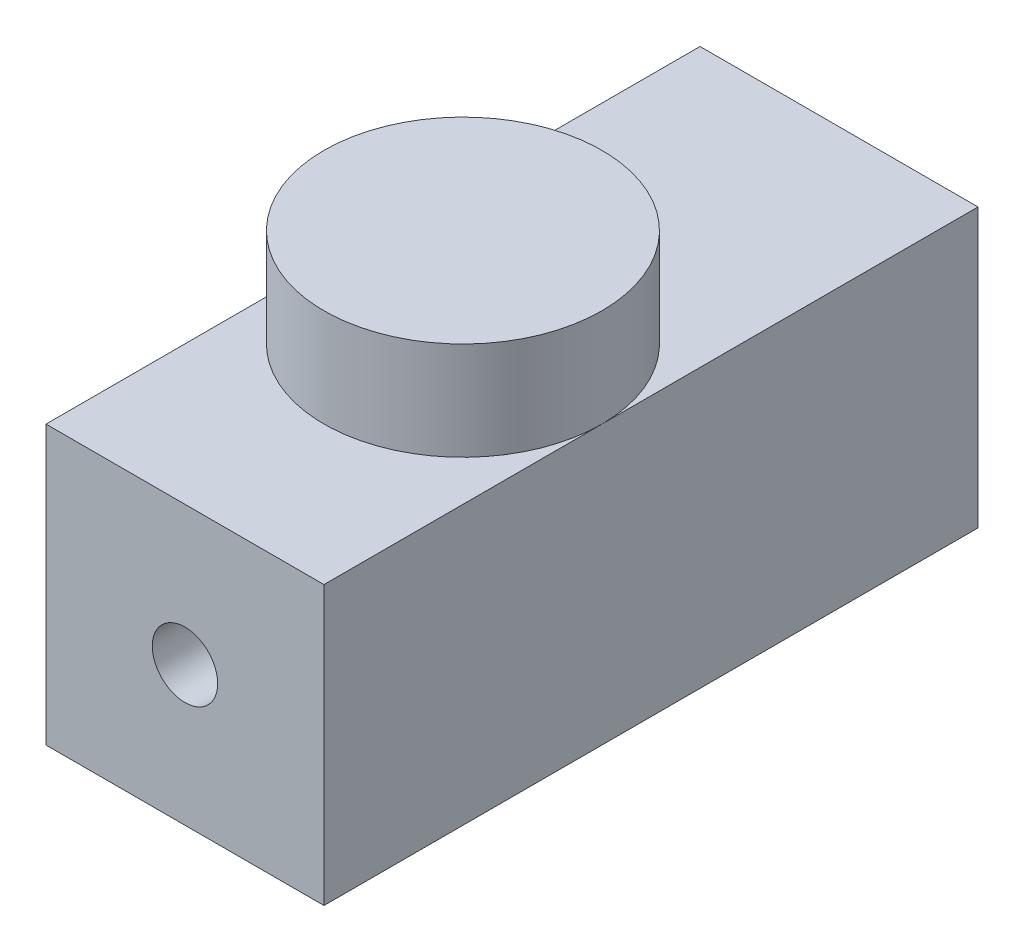
ISO-10303-21;
HEADER;
FILE_DESCRIPTION(('STEP AP214'),'2;1');
FILE_NAME('part.step','',(''),(''),'','','');
FILE_SCHEMA(('AUTOMOTIVE_DESIGN { 1 0 10303 214 1 1 1 1 }'));
ENDSEC;
DATA;
#1=APPLICATION_CONTEXT('core data for automotive mechanical design processes');
#2=APPLICATION_PROTOCOL_DEFINITION('international standard','automotive_design',2000,#1);
#3=PRODUCT_CONTEXT('',#1,'mechanical');
#4=PRODUCT('Part','Part','',(#3));
#5=PRODUCT_RELATED_PRODUCT_CATEGORY('part','',(#4));
#6=PRODUCT_DEFINITION_FORMATION('','',#4);
#7=PRODUCT_DEFINITION_CONTEXT('part definition',#1,'design');
#8=PRODUCT_DEFINITION('design','',#6,#7);
#9=PRODUCT_DEFINITION_SHAPE('','',#8);
#10=(LENGTH_UNIT() NAMED_UNIT(*) SI_UNIT(.MILLI.,.METRE.));
#11=(NAMED_UNIT(*) PLANE_ANGLE_UNIT() SI_UNIT($,.RADIAN.));
#12=(NAMED_UNIT(*) SI_UNIT($,.STERADIAN.) SOLID_ANGLE_UNIT());
#13=UNCERTAINTY_MEASURE_WITH_UNIT(LENGTH_MEASURE(1.E-05),#10,'distance_accuracy_value','');
#14=(GEOMETRIC_REPRESENTATION_CONTEXT(3) GLOBAL_UNCERTAINTY_ASSIGNED_CONTEXT((#13)) GLOBAL_UNIT_ASSIGNED_CONTEXT((#10,
#11,#12)) REPRESENTATION_CONTEXT('',''));
#15=CARTESIAN_POINT('',(0.,0.,0.));
#16=DIRECTION('',(0.,0.,1.));
#17=DIRECTION('',(1.,0.,0.));
#18=AXIS2_PLACEMENT_3D('',#15,#16,#17);
#19=CARTESIAN_POINT('',(0.,0.,2.));
#20=DIRECTION('',(0.,0.,-1.));
#21=DIRECTION('',(-1.,0.,0.));
#22=AXIS2_PLACEMENT_3D('',#19,#20,#21);
#23=CYLINDRICAL_SURFACE('',#22,3.);
#24=CARTESIAN_POINT('',(2.59807621135332,-1.5,-2.55390835220332));
#25=CARTESIAN_POINT('',(2.63732121190706,-1.4320184998094,-2.53834918738087));
#26=CARTESIAN_POINT('',(2.67395099941356,-1.36241468177571,-2.52342292053088));
#27=CARTESIAN_POINT('',(2.74175515732418,-1.22024418755296,-2.4952170083473));
#28=CARTESIAN_POINT('',(2.77292729261281,-1.1476763124049,-2.48193803829003));
#29=CARTESIAN_POINT('',(2.85789750954341,-0.92597484514707,-2.44515231181661));
#30=CARTESIAN_POINT('',(2.90311695811549,-0.772899435534057,-2.42471007878426));
#31=CARTESIAN_POINT('',(2.96883496251602,-0.460056737105672,-2.39461281977425));
#32=CARTESIAN_POINT('',(2.98926236893332,-0.300271543502325,-2.38498884637116));
#33=CARTESIAN_POINT('',(3.00421539914929,0.0205853614363783,-2.37796860747477));
#34=CARTESIAN_POINT('',(2.99877805309421,0.181654904122624,-2.38055486075833));
#35=CARTESIAN_POINT('',(2.96315000144787,0.493223208779222,-2.39717092123124));
#36=CARTESIAN_POINT('',(2.93404929137837,0.643876613125216,-2.41069668213226));
#37=CARTESIAN_POINT('',(2.8536523843714,0.938055541846204,-2.44688349613029));
#38=CARTESIAN_POINT('',(2.80233941255606,1.08157558754765,-2.46955145260105));
#39=CARTESIAN_POINT('',(2.67703177083536,1.36311681866821,-2.52242122973002));
#40=CARTESIAN_POINT('',(2.6022965417271,1.50076190190688,-2.55286194339455));
#41=CARTESIAN_POINT('',(2.43290924776829,1.76216663974117,-2.61761873907662));
#42=CARTESIAN_POINT('',(2.33825182389594,1.88592254442002,-2.6519358626859));
#43=CARTESIAN_POINT('',(2.12196875961792,2.12738220287424,-2.724213742667));
#44=CARTESIAN_POINT('',(1.99870869844901,2.24361042376763,-2.76223070731837));
#45=CARTESIAN_POINT('',(1.73376410903995,2.45411740377086,-2.83495670378048));
#46=CARTESIAN_POINT('',(1.59207580706478,2.54839165608273,-2.86966505552377));
#47=CARTESIAN_POINT('',(1.29165539351073,2.71317640451826,-2.93247086507014));
#48=CARTESIAN_POINT('',(1.1327309990258,2.78337246117049,-2.9604795012328));
#49=CARTESIAN_POINT('',(0.803819139792675,2.89551595249851,-3.0060745623748));
#50=CARTESIAN_POINT('',(0.63383861968251,2.93748093546857,-3.02366746090726));
#51=CARTESIAN_POINT('',(0.300488662815284,2.98933786081781,-3.04551998558555));
#52=CARTESIAN_POINT('',(0.137491631754733,3.00127275329246,-3.05062817359713));
#53=CARTESIAN_POINT('',(-0.188214778226381,2.99851284036458,-3.04945288748782));
#54=CARTESIAN_POINT('',(-0.350924215472211,2.98382425806823,-3.04317207548948));
#55=CARTESIAN_POINT('',(-0.663954012735901,2.92972555253106,-3.02043084852889));
#56=CARTESIAN_POINT('',(-0.814504322154816,2.89143381693145,-3.0044314045083));
#57=CARTESIAN_POINT('',(-1.10692415895838,2.79258875480741,-2.96421102617649));
#58=CARTESIAN_POINT('',(-1.24879227422242,2.73203181811128,-2.93998875863157));
#59=CARTESIAN_POINT('',(-1.52613809020316,2.58772378265098,-2.88443354692245));
#60=CARTESIAN_POINT('',(-1.6611324821036,2.50314108140678,-2.85285472635883));
#61=CARTESIAN_POINT('',(-1.91556256719407,2.31424955495618,-2.78613758631303));
#62=CARTESIAN_POINT('',(-2.03499158666064,2.20993231516289,-2.7509977514327));
#63=CARTESIAN_POINT('',(-2.26404124137376,1.97557238707093,-2.67782380261578));
#64=CARTESIAN_POINT('',(-2.372303881634,1.84420551754709,-2.63976612269924));
#65=CARTESIAN_POINT('',(-2.56553052653588,1.56428261614774,-2.56752921528657));
#66=CARTESIAN_POINT('',(-2.65048808953081,1.41572184788948,-2.53335106163924));
#67=CARTESIAN_POINT('',(-2.79473102937518,1.10411727856912,-2.47297232295241));
#68=CARTESIAN_POINT('',(-2.85388987857851,0.941006719903006,-2.44681123907503));
#69=CARTESIAN_POINT('',(-2.94331018381703,0.605754931675806,-2.40648911663507));
#70=CARTESIAN_POINT('',(-2.97361030155961,0.433626111060827,-2.3923120261295));
#71=CARTESIAN_POINT('',(-3.00254727381295,0.100936270083843,-2.3787648467583));
#72=CARTESIAN_POINT('',(-3.00365486795747,-0.0593655292717487,-2.37823939620428));
#73=CARTESIAN_POINT('',(-2.98039430644696,-0.377847811322213,-2.38914147197056));
#74=CARTESIAN_POINT('',(-2.95600007774496,-0.536025955169475,-2.4005812315199));
#75=CARTESIAN_POINT('',(-2.88559204724414,-0.833626096403907,-2.43260529818103));
#76=CARTESIAN_POINT('',(-2.84137006195668,-0.973558275333163,-2.45242517983944));
#77=CARTESIAN_POINT('',(-2.76061933830015,-1.17655899775583,-2.48718289477135));
#78=CARTESIAN_POINT('',(-2.73132033148845,-1.2430402800381,-2.49959825143357));
#79=CARTESIAN_POINT('',(-2.6681107809456,-1.37347336713796,-2.5258001081459));
#80=CARTESIAN_POINT('',(-2.6342013980018,-1.43742580344605,-2.53958626282639));
#81=CARTESIAN_POINT('',(-2.59807621135331,-1.5,-2.55390835220332));
#82=B_SPLINE_CURVE_WITH_KNOTS('',3,(#24,#25,#26,#27,#28,#29,#30,#31,#32,#33,#34,#35,#36,#37,#38,
#39,#40,#41,#42,#43,#44,#45,#46,#47,#48,#49,#50,#51,#52,#53,#54,#55,#56,#57,#58,#59,#60,#61,#62,
#63,#64,#65,#66,#67,#68,#69,#70,#71,#72,#73,#74,#75,#76,#77,#78,#79,#80,#81),.UNSPECIFIED.,.F.,
.F.,(4,2,2,2,2,2,2,2,2,2,2,2,2,2,2,2,2,2,2,2,2,2,2,2,2,2,2,2,4),(0.,0.23994718859513,
0.47999241596185,0.960278827431643,1.44194035353768,1.92291250037383,2.38290639013268,
2.84324827868749,3.31993293521606,3.79674598301762,4.31525372702653,4.83386781872064,
5.35901742337412,5.88384029529329,6.37185612374836,6.85975789561614,7.32615067846419,
7.79261911753865,8.27776478022382,8.76311777175903,9.28400023674185,9.80502653165455,
10.3285801802524,10.8514314394011,11.3298742473193,11.8088066936934,12.2511922960062,
12.4721326598609,12.6930174986392),.UNSPECIFIED.);
#83=CARTESIAN_POINT('',(2.59807621135331,-1.5,-2.55390835220332));
#84=VERTEX_POINT('',#83);
#85=CARTESIAN_POINT('',(-2.59807621135331,-1.5,-2.55390835220332));
#86=VERTEX_POINT('',#85);
#87=EDGE_CURVE('E287',#84,#86,#82,.T.);
#88=ORIENTED_EDGE('',*,*,#87,.T.);
#89=DIRECTION('',(0.,0.,-1.));
#90=VECTOR('',#89,1.);
#91=CARTESIAN_POINT('',(-2.59807621135331,-1.5,2.));
#92=LINE('',#91,#90);
#93=CARTESIAN_POINT('',(-2.59807621135331,-1.5,0.));
#94=VERTEX_POINT('',#93);
#95=EDGE_CURVE('E195',#86,#94,#92,.F.);
#96=ORIENTED_EDGE('',*,*,#95,.T.);
#97=CARTESIAN_POINT('',(0.,0.,0.));
#98=DIRECTION('',(0.,0.,-1.));
#99=DIRECTION('',(-1.,0.,0.));
#100=AXIS2_PLACEMENT_3D('',#97,#98,#99);
#101=CIRCLE('',#100,3.);
#102=CARTESIAN_POINT('',(2.59807621135332,-1.5,0.));
#103=VERTEX_POINT('',#102);
#104=EDGE_CURVE('E218',#103,#94,#101,.T.);
#105=ORIENTED_EDGE('',*,*,#104,.F.);
#106=DIRECTION('',(0.,0.,-1.));
#107=VECTOR('',#106,1.);
#108=CARTESIAN_POINT('',(2.59807621135332,-1.5,2.));
#109=LINE('',#108,#107);
#110=EDGE_CURVE('E204',#103,#84,#109,.T.);
#111=ORIENTED_EDGE('',*,*,#110,.T.);
#112=EDGE_LOOP('',(#88,#96,#105,#111));
#113=FACE_BOUND('',#112,.T.);
#114=CARTESIAN_POINT('',(0.,0.,-12.));
#115=DIRECTION('',(0.,0.,-1.));
#116=DIRECTION('',(-1.,0.,0.));
#117=AXIS2_PLACEMENT_3D('',#114,#115,#116);
#118=CIRCLE('',#117,3.);
#119=CARTESIAN_POINT('',(-3.,0.,-12.));
#120=VERTEX_POINT('',#119);
#121=EDGE_CURVE('E11',#120,#120,#118,.F.);
#122=ORIENTED_EDGE('',*,*,#121,.F.);
#123=EDGE_LOOP('',(#122));
#124=FACE_BOUND('',#123,.T.);
#125=ADVANCED_FACE('F42',(#113,#124),#23,.F.);
#126=CARTESIAN_POINT('',(0.,0.,21.));
#127=DIRECTION('',(0.,0.,-1.));
#128=DIRECTION('',(-1.,0.,0.));
#129=AXIS2_PLACEMENT_3D('',#126,#127,#128);
#130=CYLINDRICAL_SURFACE('',#129,3.5);
#131=CARTESIAN_POINT('',(2.51489137764372,2.43419829895866,2.36435903736387));
#132=CARTESIAN_POINT('',(2.55104727161985,2.3968592590722,2.41997618318839));
#133=CARTESIAN_POINT('',(2.58543176127952,2.35965468387822,2.4768556993659));
#134=CARTESIAN_POINT('',(2.65063489261218,2.28616127627483,2.59336511233787));
#135=CARTESIAN_POINT('',(2.68144694491816,2.24987422966124,2.65299981651324));
#136=CARTESIAN_POINT('',(2.73990732764464,2.17832164532824,2.77621833042016));
#137=CARTESIAN_POINT('',(2.76748337136312,2.14308920007419,2.83985604960378));
#138=CARTESIAN_POINT('',(2.81855932452775,2.07545640218766,2.97013778580621));
#139=CARTESIAN_POINT('',(2.84206227648358,2.04305394466989,3.03677951159776));
#140=CARTESIAN_POINT('',(2.89255149917531,1.97121832568649,3.19831429873823));
#141=CARTESIAN_POINT('',(2.9176642071026,1.93355254699554,3.29462014616058));
#142=CARTESIAN_POINT('',(2.9584848327623,1.87050740704512,3.49258412606976));
#143=CARTESIAN_POINT('',(2.97425323357771,1.84504923884585,3.59420309912707));
#144=CARTESIAN_POINT('',(2.99364153625954,1.81339810629114,3.78572968252594));
#145=CARTESIAN_POINT('',(2.99873721997319,1.80487516697823,3.87508639592764));
#146=CARTESIAN_POINT('',(3.00084618039508,1.80136928186678,4.05420987010352));
#147=CARTESIAN_POINT('',(2.99785714814791,1.80639020412786,4.1439767407077));
#148=CARTESIAN_POINT('',(2.98412011563994,1.82898435745681,4.32072531783922));
#149=CARTESIAN_POINT('',(2.97341308903591,1.84649129698581,4.40771920930295));
#150=CARTESIAN_POINT('',(2.94506722408364,1.89136781681036,4.57797387127647));
#151=CARTESIAN_POINT('',(2.92741786911567,1.91875235498569,4.66122876355261));
#152=CARTESIAN_POINT('',(2.88781972012299,1.97778753830069,4.81629104045118));
#153=CARTESIAN_POINT('',(2.86638523236495,2.00885158464487,4.88846139119754));
#154=CARTESIAN_POINT('',(2.81885732552745,2.07502121949334,5.02935430790497));
#155=CARTESIAN_POINT('',(2.79276031530613,2.11012991578893,5.09807416360722));
#156=CARTESIAN_POINT('',(2.70776333039438,2.21957251614343,5.29976954044158));
#157=CARTESIAN_POINT('',(2.64226497106846,2.29785120632489,5.42787579417068));
#158=CARTESIAN_POINT('',(2.51961635591613,2.43038828283934,5.63109608248835));
#159=CARTESIAN_POINT('',(2.46703909451512,2.48389339413969,5.7095681571944));
#160=CARTESIAN_POINT('',(2.3546437027452,2.59068787023778,5.86133859206422));
#161=CARTESIAN_POINT('',(2.29482300362978,2.64397715153117,5.93463510213875));
#162=CARTESIAN_POINT('',(2.10467877779133,2.8012988480337,6.14621115372963));
#163=CARTESIAN_POINT('',(1.96336869956244,2.90313159946516,6.27668382174231));
#164=CARTESIAN_POINT('',(1.69293861392622,3.06626259460991,6.48084458173163));
#165=CARTESIAN_POINT('',(1.57041686660689,3.1311714428974,6.56043661638214));
#166=CARTESIAN_POINT('',(1.310436519264,3.24853732941626,6.70270730764478));
#167=CARTESIAN_POINT('',(1.1729983986845,3.3010111327803,6.76540875221549));
#168=CARTESIAN_POINT('',(0.907285771269549,3.38277006701788,6.8624640877246));
#169=CARTESIAN_POINT('',(0.780771114579154,3.41436245571142,6.8996716544676));
#170=CARTESIAN_POINT('',(0.521318341934607,3.46346882240351,6.95733808483595));
#171=CARTESIAN_POINT('',(0.388383728169682,3.48099038631572,6.97780597332664));
#172=CARTESIAN_POINT('',(0.119388231108074,3.50056873534359,7.00066939854563));
#173=CARTESIAN_POINT('',(-0.0166811387744239,3.50257691886003,7.00300813886013));
#174=CARTESIAN_POINT('',(-0.287189024306195,3.49082446568215,6.98929216444791));
#175=CARTESIAN_POINT('',(-0.421627443840481,3.47706290416516,6.97323637096681));
#176=CARTESIAN_POINT('',(-0.678503122345018,3.43595027794409,6.92504743473385));
#177=CARTESIAN_POINT('',(-0.801206644279197,3.40928397851332,6.89372389826069));
#178=CARTESIAN_POINT('',(-1.03895858306511,3.34451435739044,6.81712472164344));
#179=CARTESIAN_POINT('',(-1.15400333970316,3.30640561448337,6.77184246784944));
#180=CARTESIAN_POINT('',(-1.41502594680357,3.20527096280849,6.6505229045574));
#181=CARTESIAN_POINT('',(-1.55703275657344,3.13822380620818,6.56928996043567));
#182=CARTESIAN_POINT('',(-1.82208855058899,2.99215460455576,6.38868740049971));
#183=CARTESIAN_POINT('',(-1.9451053105068,2.91311264641347,6.28928756789711));
#184=CARTESIAN_POINT('',(-2.17372268780184,2.74685740405588,6.0736544527252));
#185=CARTESIAN_POINT('',(-2.27899704233387,2.65952941901191,5.95716707982304));
#186=CARTESIAN_POINT('',(-2.46982445935934,2.48329999146304,5.71007907293699));
#187=CARTESIAN_POINT('',(-2.55537755514185,2.39439855161437,5.5794784627765));
#188=CARTESIAN_POINT('',(-2.6909490306155,2.23988696926097,5.33206703564061));
#189=CARTESIAN_POINT('',(-2.74465667667409,2.1732387272304,5.21791941315249));
#190=CARTESIAN_POINT('',(-2.83851721615466,2.04910297280901,4.97939016279977));
#191=CARTESIAN_POINT('',(-2.87869145022314,1.99160111392147,4.85502503570241));
#192=CARTESIAN_POINT('',(-2.93329316695613,1.90982575819557,4.63581072366294));
#193=CARTESIAN_POINT('',(-2.95184234882337,1.88078039322871,4.54382047239381));
#194=CARTESIAN_POINT('',(-2.9803621627429,1.83525910488157,4.35559592962962));
#195=CARTESIAN_POINT('',(-2.99035710206832,1.81874758123284,4.25937448594567));
#196=CARTESIAN_POINT('',(-3.00091812980939,1.80128301695993,4.06407766213972));
#197=CARTESIAN_POINT('',(-3.00140233077628,1.80046509966333,3.96498484720031));
#198=CARTESIAN_POINT('',(-2.99267001381543,1.81493206716691,3.76837527672561));
#199=CARTESIAN_POINT('',(-2.98343987708806,1.83023955865307,3.67086092893567));
#200=CARTESIAN_POINT('',(-2.95288676851072,1.87921476953453,3.45702241630219));
#201=CARTESIAN_POINT('',(-2.929167099891,1.91644468020788,3.34189751756191));
#202=CARTESIAN_POINT('',(-2.87017835611937,2.00370737513847,3.11940392455444));
#203=CARTESIAN_POINT('',(-2.8348492117846,2.05380644561664,3.01207919376662));
#204=CARTESIAN_POINT('',(-2.75623362324816,2.15805830117741,2.81080534574606));
#205=CARTESIAN_POINT('',(-2.71348845447864,2.21183920264226,2.71644566587264));
#206=CARTESIAN_POINT('',(-2.64327511874505,2.29442527880475,2.58026176837923));
#207=CARTESIAN_POINT('',(-2.61903205699824,2.32208678102268,2.53603092139465));
#208=CARTESIAN_POINT('',(-2.56849585284578,2.3778657925977,2.44908032569322));
#209=CARTESIAN_POINT('',(-2.54220346821209,2.4059831303845,2.4063600268398));
#210=CARTESIAN_POINT('',(-2.51489137764373,2.43419829895866,2.36435903736387));
#211=B_SPLINE_CURVE_WITH_KNOTS('',3,(#131,#132,#133,#134,#135,#136,#137,#138,#139,#140,#141,
#142,#143,#144,#145,#146,#147,#148,#149,#150,#151,#152,#153,#154,#155,#156,#157,#158,#159,#160,
#161,#162,#163,#164,#165,#166,#167,#168,#169,#170,#171,#172,#173,#174,#175,#176,#177,#178,#179,
#180,#181,#182,#183,#184,#185,#186,#187,#188,#189,#190,#191,#192,#193,#194,#195,#196,#197,#198,
#199,#200,#201,#202,#203,#204,#205,#206,#207,#208,#209,#210),.UNSPECIFIED.,.F.,.F.,(4,2,2,2,2,2,
2,2,2,2,2,2,2,2,2,2,2,2,2,2,2,2,2,2,2,2,2,2,2,2,2,2,2,2,2,2,2,2,2,4),(0.,0.228359937932881,
0.457134601765042,0.690311456162153,0.923313374720464,1.24159562653338,1.55779456373088,
1.8262091891625,2.09470048059399,2.36177679254866,2.62925925418337,2.87322930566078,
3.11738808288767,3.60705011577487,3.93241305020062,4.25789170816498,4.90681717899346,
5.38476259322378,5.86205992015054,6.26714048266651,6.67200250980327,7.07813240976237,
7.48428612858193,7.87092370043454,8.25774474373482,8.78527864552214,9.31369810886647,
9.85096929913652,10.3882395824971,10.8153476834947,11.2417790961168,11.5355041678648,
11.8283918086644,12.1238001167752,12.4196231183456,12.7874543767605,13.1572196323842,
13.5067492476582,13.6792799750752,13.8517472062458),.UNSPECIFIED.);
#212=CARTESIAN_POINT('',(2.51489137764372,2.43419829895866,2.36435903736387));
#213=VERTEX_POINT('',#212);
#214=CARTESIAN_POINT('',(-2.51489137764372,2.43419829895867,2.36435903736386));
#215=VERTEX_POINT('',#214);
#216=EDGE_CURVE('E188',#213,#215,#211,.T.);
#217=ORIENTED_EDGE('',*,*,#216,.F.);
#218=CARTESIAN_POINT('',(0.,0.,2.36435903736386));
#219=DIRECTION('',(0.,0.,1.));
#220=DIRECTION('',(1.,0.,0.));
#221=AXIS2_PLACEMENT_3D('',#218,#219,#220);
#222=CIRCLE('',#221,3.5);
#223=EDGE_CURVE('E448',#215,#213,#222,.T.);
#224=ORIENTED_EDGE('',*,*,#223,.F.);
#225=EDGE_LOOP('',(#217,#224));
#226=FACE_BOUND('',#225,.T.);
#227=CARTESIAN_POINT('',(0.,0.,16.));
#228=DIRECTION('',(0.,0.,1.));
#229=DIRECTION('',(1.,0.,0.));
#230=AXIS2_PLACEMENT_3D('',#227,#228,#229);
#231=CIRCLE('',#230,3.5);
#232=CARTESIAN_POINT('',(3.5,0.,16.));
#233=VERTEX_POINT('',#232);
#234=EDGE_CURVE('E350',#233,#233,#231,.T.);
#235=ORIENTED_EDGE('',*,*,#234,.T.);
#236=EDGE_LOOP('',(#235));
#237=FACE_BOUND('',#236,.T.);
#238=ADVANCED_FACE('F246',(#226,#237),#130,.F.);
#239=CARTESIAN_POINT('',(8.5,8.5,21.));
#240=DIRECTION('',(0.,-1.,0.));
#241=DIRECTION('',(1.,0.,0.));
#242=AXIS2_PLACEMENT_3D('',#239,#240,#241);
#243=PLANE('',#242);
#244=CARTESIAN_POINT('',(0.,8.5,4.));
#245=DIRECTION('',(0.,1.,0.));
#246=DIRECTION('',(-1.,0.,0.));
#247=AXIS2_PLACEMENT_3D('',#244,#245,#246);
#248=CIRCLE('',#247,3.);
#249=CARTESIAN_POINT('',(-3.,8.5,4.));
#250=VERTEX_POINT('',#249);
#251=EDGE_CURVE('E319',#250,#250,#248,.T.);
#252=ORIENTED_EDGE('',*,*,#251,.F.);
#253=EDGE_LOOP('',(#252));
#254=FACE_BOUND('',#253,.T.);
#255=DIRECTION('',(1.,0.,0.));
#256=VECTOR('',#255,1.);
#257=CARTESIAN_POINT('',(-7.0500861476354,8.49999999999999,4.));
#258=LINE('',#257,#256);
#259=CARTESIAN_POINT('',(-7.0500861476354,8.49999999999999,4.));
#260=VERTEX_POINT('',#259);
#261=CARTESIAN_POINT('',(-4.74236756091018,8.49999999999999,4.));
#262=VERTEX_POINT('',#261);
#263=EDGE_CURVE('E156',#260,#262,#258,.T.);
#264=ORIENTED_EDGE('',*,*,#263,.F.);
#265=CARTESIAN_POINT('',(0.,8.5,4.));
#266=DIRECTION('',(0.,1.,0.));
#267=DIRECTION('',(-1.,0.,0.));
#268=AXIS2_PLACEMENT_3D('',#265,#266,#267);
#269=CIRCLE('',#268,7.0500861476354);
#270=CARTESIAN_POINT('',(7.05008614763539,8.5,4.));
#271=VERTEX_POINT('',#270);
#272=EDGE_CURVE('E149',#260,#271,#269,.T.);
#273=ORIENTED_EDGE('',*,*,#272,.T.);
#274=DIRECTION('',(1.,0.,0.));
#275=VECTOR('',#274,1.);
#276=CARTESIAN_POINT('',(4.74236756091018,8.5,4.));
#277=LINE('',#276,#275);
#278=CARTESIAN_POINT('',(4.74236756091018,8.5,4.));
#279=VERTEX_POINT('',#278);
#280=EDGE_CURVE('E154',#279,#271,#277,.T.);
#281=ORIENTED_EDGE('',*,*,#280,.F.);
#282=CARTESIAN_POINT('',(0.,8.5,4.));
#283=DIRECTION('',(0.,-1.,0.));
#284=DIRECTION('',(1.,0.,0.));
#285=AXIS2_PLACEMENT_3D('',#282,#283,#284);
#286=CIRCLE('',#285,4.74236756091018);
#287=EDGE_CURVE('E181',#262,#279,#286,.T.);
#288=ORIENTED_EDGE('',*,*,#287,.F.);
#289=EDGE_LOOP('',(#264,#273,#281,#288));
#290=FACE_BOUND('',#289,.T.);
#291=ADVANCED_FACE('F151',(#254,#290),#243,.F.);
#292=CARTESIAN_POINT('',(0.,8.5,4.));
#293=DIRECTION('',(0.,1.,0.));
#294=DIRECTION('',(-1.,0.,0.));
#295=AXIS2_PLACEMENT_3D('',#292,#293,#294);
#296=CIRCLE('',#295,8.5);
#297=CARTESIAN_POINT('',(-8.5,8.49999999999999,4.));
#298=VERTEX_POINT('',#297);
#299=CARTESIAN_POINT('',(8.49999999999999,8.5,4.));
#300=VERTEX_POINT('',#299);
#301=EDGE_CURVE('E161',#298,#300,#296,.T.);
#302=ORIENTED_EDGE('',*,*,#301,.F.);
#303=DIRECTION('',(0.,0.,-1.));
#304=VECTOR('',#303,1.);
#305=CARTESIAN_POINT('',(-8.5,8.49999999999999,21.));
#306=LINE('',#305,#304);
#307=CARTESIAN_POINT('',(-8.5,8.49999999999999,21.));
#308=VERTEX_POINT('',#307);
#309=EDGE_CURVE('E438',#308,#298,#306,.T.);
#310=ORIENTED_EDGE('',*,*,#309,.F.);
#311=DIRECTION('',(-1.,0.,0.));
#312=VECTOR('',#311,1.);
#313=CARTESIAN_POINT('',(8.5,8.5,21.));
#314=LINE('',#313,#312);
#315=CARTESIAN_POINT('',(8.5,8.5,21.));
#316=VERTEX_POINT('',#315);
#317=EDGE_CURVE('E434',#316,#308,#314,.T.);
#318=ORIENTED_EDGE('',*,*,#317,.F.);
#319=DIRECTION('',(0.,0.,-1.));
#320=VECTOR('',#319,1.);
#321=CARTESIAN_POINT('',(8.5,8.5,21.));
#322=LINE('',#321,#320);
#323=EDGE_CURVE('E441',#316,#300,#322,.T.);
#324=ORIENTED_EDGE('',*,*,#323,.T.);
#325=EDGE_LOOP('',(#302,#310,#318,#324));
#326=FACE_BOUND('',#325,.T.);
#327=ADVANCED_FACE('F258',(#326),#243,.F.);
#328=CARTESIAN_POINT('',(-2.5475576701565,1.58428214571357,0.));
#329=VERTEX_POINT('',#328);
#330=CARTESIAN_POINT('',(2.5475576701565,1.58428214571357,0.));
#331=VERTEX_POINT('',#330);
#332=EDGE_CURVE('E219',#329,#331,#101,.T.);
#333=ORIENTED_EDGE('',*,*,#332,.F.);
#334=CARTESIAN_POINT('',(-2.5475576701565,1.58428214571357,0.));
#335=CARTESIAN_POINT('',(-2.50126774732187,1.65870011455872,-0.0294888935608918));
#336=CARTESIAN_POINT('',(-2.45188663510014,1.7308504974432,-0.0598031355130589));
#337=CARTESIAN_POINT('',(-2.3471954619681,1.87037304891713,-0.121212166214668));
#338=CARTESIAN_POINT('',(-2.29188483514368,1.93774476040775,-0.15230702924947));
#339=CARTESIAN_POINT('',(-2.17522256381325,2.06787026701592,-0.214601124978778));
#340=CARTESIAN_POINT('',(-2.11383430957125,2.13059152910605,-0.245799740225049));
#341=CARTESIAN_POINT('',(-1.98555141446926,2.25062253618106,-0.307283739912744));
#342=CARTESIAN_POINT('',(-1.91865684579781,2.3079323520896,-0.337569136319483));
#343=CARTESIAN_POINT('',(-1.77946575530546,2.41688396784409,-0.396507207707698));
#344=CARTESIAN_POINT('',(-1.70715811598851,2.4685135331752,-0.425156296899396));
#345=CARTESIAN_POINT('',(-1.55758525984018,2.56551573676955,-0.47999114835835));
#346=CARTESIAN_POINT('',(-1.48032077721012,2.61088929854316,-0.506177274026153));
#347=CARTESIAN_POINT('',(-1.32140382124292,2.69480003623867,-0.555309339238523));
#348=CARTESIAN_POINT('',(-1.23976123533201,2.73335183578564,-0.578262187775081));
#349=CARTESIAN_POINT('',(-1.07252742674706,2.80319231667098,-0.620298649865501));
#350=CARTESIAN_POINT('',(-0.986939165062856,2.83448634149651,-0.639385108703793));
#351=CARTESIAN_POINT('',(-0.820456225093919,2.88682399323958,-0.671554060708586));
#352=CARTESIAN_POINT('',(-0.739849419339515,2.90854384700735,-0.685026296005944));
#353=CARTESIAN_POINT('',(-0.576592919249843,2.94525659133011,-0.707906148295792));
#354=CARTESIAN_POINT('',(-0.493944383501248,2.96025320851671,-0.717316016915435));
#355=CARTESIAN_POINT('',(-0.32731092271939,2.98327602315158,-0.731797172960318));
#356=CARTESIAN_POINT('',(-0.243326219992719,2.99130336802371,-0.736869174571727));
#357=CARTESIAN_POINT('',(-0.0748581991796156,3.00025391473162,-0.742527378090932));
#358=CARTESIAN_POINT('',(0.00962505989700037,3.00117794109292,-0.743114100632394));
#359=CARTESIAN_POINT('',(0.239762802000241,2.9939472606468,-0.738536616352031));
#360=CARTESIAN_POINT('',(0.385187914249129,2.97869566744741,-0.728876142076195));
#361=CARTESIAN_POINT('',(0.670798220293792,2.92764780986287,-0.696891391659853));
#362=CARTESIAN_POINT('',(0.810984087189237,2.89185419429652,-0.674568748264135));
#363=CARTESIAN_POINT('',(1.08327124489216,2.80128175832323,-0.6190848549864));
#364=CARTESIAN_POINT('',(1.21534487913748,2.74644182053373,-0.585888733150598));
#365=CARTESIAN_POINT('',(1.46858699620422,2.61979612942411,-0.511182777667418));
#366=CARTESIAN_POINT('',(1.58974642972158,2.54797647328241,-0.469666135527385));
#367=CARTESIAN_POINT('',(1.83421871607757,2.37917131612338,-0.375496989183479));
#368=CARTESIAN_POINT('',(1.9558272978212,2.28014249724744,-0.322099395576848));
#369=CARTESIAN_POINT('',(2.18152748778806,2.06523382927629,-0.212682134133763));
#370=CARTESIAN_POINT('',(2.28563690070969,1.9493713343727,-0.156665206475505));
#371=CARTESIAN_POINT('',(2.41008269397287,1.78714771517011,-0.0844516960475288));
#372=CARTESIAN_POINT('',(2.43893728773514,1.74756734022151,-0.0672724897298099));
#373=CARTESIAN_POINT('',(2.49470037323961,1.66699257931917,-0.0333089569944928));
#374=CARTESIAN_POINT('',(2.52161168324382,1.62600037381415,-0.0165240835558002));
#375=CARTESIAN_POINT('',(2.5475576701565,1.58428214571357,0.));
#376=B_SPLINE_CURVE_WITH_KNOTS('',3,(#334,#335,#336,#337,#338,#339,#340,#341,#342,#343,#344,
#345,#346,#347,#348,#349,#350,#351,#352,#353,#354,#355,#356,#357,#358,#359,#360,#361,#362,#363,
#364,#365,#366,#367,#368,#369,#370,#371,#372,#373,#374,#375),.UNSPECIFIED.,.F.,.F.,(4,2,2,2,2,2,
2,2,2,2,2,2,2,2,2,2,2,2,2,2,4),(0.,0.277302390519644,0.55463127043791,0.833746122992579,
1.11285731689529,1.39255837295331,1.67221809527246,1.95127085796432,2.23011751309055,
2.48343015884598,2.73660222147633,2.98973259384485,3.2428335833828,3.68013987647702,
4.11738979318698,4.5560559581628,4.99508255013035,5.49022588813401,5.98486234750839,
6.14054200343149,6.29599115020664),.UNSPECIFIED.);
#377=EDGE_CURVE('E208',#329,#331,#376,.T.);
#378=ORIENTED_EDGE('',*,*,#377,.T.);
#379=EDGE_LOOP('',(#333,#378));
#380=FACE_BOUND('',#379,.T.);
#381=ADVANCED_FACE('F248',(#380),#23,.F.);
#382=CARTESIAN_POINT('',(0.,0.,21.));
#383=DIRECTION('',(0.,0.,1.));
#384=DIRECTION('',(1.,0.,0.));
#385=AXIS2_PLACEMENT_3D('',#382,#383,#384);
#386=PLANE('',#385);
#387=DIRECTION('',(0.,-1.,0.));
#388=VECTOR('',#387,1.);
#389=CARTESIAN_POINT('',(-8.5,-8.50000000000001,21.));
#390=LINE('',#389,#388);
#391=CARTESIAN_POINT('',(-8.5,-8.50000000000001,21.));
#392=VERTEX_POINT('',#391);
#393=EDGE_CURVE('E418',#308,#392,#390,.T.);
#394=ORIENTED_EDGE('',*,*,#393,.T.);
#395=DIRECTION('',(1.,0.,0.));
#396=VECTOR('',#395,1.);
#397=CARTESIAN_POINT('',(8.5,-8.5,21.));
#398=LINE('',#397,#396);
#399=CARTESIAN_POINT('',(8.5,-8.5,21.));
#400=VERTEX_POINT('',#399);
#401=EDGE_CURVE('E424',#392,#400,#398,.T.);
#402=ORIENTED_EDGE('',*,*,#401,.T.);
#403=DIRECTION('',(0.,1.,0.));
#404=VECTOR('',#403,1.);
#405=CARTESIAN_POINT('',(8.5,-8.5,21.));
#406=LINE('',#405,#404);
#407=EDGE_CURVE('E431',#400,#316,#406,.T.);
#408=ORIENTED_EDGE('',*,*,#407,.T.);
#409=ORIENTED_EDGE('',*,*,#317,.T.);
#410=EDGE_LOOP('',(#394,#402,#408,#409));
#411=FACE_BOUND('',#410,.T.);
#412=CARTESIAN_POINT('',(0.,0.,21.));
#413=DIRECTION('',(0.,0.,1.));
#414=DIRECTION('',(1.,0.,0.));
#415=AXIS2_PLACEMENT_3D('',#412,#413,#414);
#416=CIRCLE('',#415,2.);
#417=CARTESIAN_POINT('',(2.,0.,21.));
#418=VERTEX_POINT('',#417);
#419=EDGE_CURVE('E360',#418,#418,#416,.T.);
#420=ORIENTED_EDGE('',*,*,#419,.F.);
#421=EDGE_LOOP('',(#420));
#422=FACE_BOUND('',#421,.T.);
#423=ADVANCED_FACE('F257',(#411,#422),#386,.T.);
#424=CARTESIAN_POINT('',(-8.5,-8.50000000000001,21.));
#425=DIRECTION('',(1.,0.,0.));
#426=DIRECTION('',(0.,0.,-1.));
#427=AXIS2_PLACEMENT_3D('',#424,#425,#426);
#428=PLANE('',#427);
#429=ORIENTED_EDGE('',*,*,#309,.T.);
#430=CARTESIAN_POINT('',(-8.5,8.5,-19.));
#431=VERTEX_POINT('',#430);
#432=EDGE_CURVE('E437',#298,#431,#306,.T.);
#433=ORIENTED_EDGE('',*,*,#432,.T.);
#434=DIRECTION('',(0.,1.,0.));
#435=VECTOR('',#434,1.);
#436=CARTESIAN_POINT('',(-8.5,-8.5,-19.));
#437=LINE('',#436,#435);
#438=CARTESIAN_POINT('',(-8.5,-8.5,-19.));
#439=VERTEX_POINT('',#438);
#440=EDGE_CURVE('E416',#439,#431,#437,.T.);
#441=ORIENTED_EDGE('',*,*,#440,.F.);
#442=DIRECTION('',(0.,0.,-1.));
#443=VECTOR('',#442,1.);
#444=CARTESIAN_POINT('',(-8.5,-8.50000000000001,21.));
#445=LINE('',#444,#443);
#446=EDGE_CURVE('E445',#392,#439,#445,.T.);
#447=ORIENTED_EDGE('',*,*,#446,.F.);
#448=ORIENTED_EDGE('',*,*,#393,.F.);
#449=EDGE_LOOP('',(#429,#433,#441,#447,#448));
#450=FACE_BOUND('',#449,.T.);
#451=ADVANCED_FACE('F44',(#450),#428,.F.);
#452=CARTESIAN_POINT('',(8.5,-8.5,21.));
#453=DIRECTION('',(0.,1.,0.));
#454=DIRECTION('',(-1.,0.,0.));
#455=AXIS2_PLACEMENT_3D('',#452,#453,#454);
#456=PLANE('',#455);
#457=ORIENTED_EDGE('',*,*,#446,.T.);
#458=DIRECTION('',(-1.,0.,0.));
#459=VECTOR('',#458,1.);
#460=CARTESIAN_POINT('',(-8.5,-8.5,-19.));
#461=LINE('',#460,#459);
#462=CARTESIAN_POINT('',(8.5,-8.5,-19.));
#463=VERTEX_POINT('',#462);
#464=EDGE_CURVE('E279',#463,#439,#461,.T.);
#465=ORIENTED_EDGE('',*,*,#464,.F.);
#466=DIRECTION('',(0.,0.,-1.));
#467=VECTOR('',#466,1.);
#468=CARTESIAN_POINT('',(8.5,-8.5,21.));
#469=LINE('',#468,#467);
#470=EDGE_CURVE('E407',#400,#463,#469,.T.);
#471=ORIENTED_EDGE('',*,*,#470,.F.);
#472=ORIENTED_EDGE('',*,*,#401,.F.);
#473=EDGE_LOOP('',(#457,#465,#471,#472));
#474=FACE_BOUND('',#473,.T.);
#475=ADVANCED_FACE('F395',(#474),#456,.F.);
#476=CARTESIAN_POINT('',(8.5,-8.5,21.));
#477=DIRECTION('',(-1.,0.,0.));
#478=DIRECTION('',(0.,0.,1.));
#479=AXIS2_PLACEMENT_3D('',#476,#477,#478);
#480=PLANE('',#479);
#481=DIRECTION('',(0.,-1.,0.));
#482=VECTOR('',#481,1.);
#483=CARTESIAN_POINT('',(8.5,-8.5,-19.));
#484=LINE('',#483,#482);
#485=CARTESIAN_POINT('',(8.5,8.5,-19.));
#486=VERTEX_POINT('',#485);
#487=EDGE_CURVE('E274',#486,#463,#484,.T.);
#488=ORIENTED_EDGE('',*,*,#487,.F.);
#489=EDGE_CURVE('E403',#300,#486,#322,.T.);
#490=ORIENTED_EDGE('',*,*,#489,.F.);
#491=ORIENTED_EDGE('',*,*,#323,.F.);
#492=ORIENTED_EDGE('',*,*,#407,.F.);
#493=ORIENTED_EDGE('',*,*,#470,.T.);
#494=EDGE_LOOP('',(#488,#490,#491,#492,#493));
#495=FACE_BOUND('',#494,.T.);
#496=ADVANCED_FACE('F389',(#495),#480,.F.);
#497=EDGE_CURVE('E50',#300,#298,#296,.T.);
#498=ORIENTED_EDGE('',*,*,#497,.F.);
#499=ORIENTED_EDGE('',*,*,#489,.T.);
#500=DIRECTION('',(1.,0.,0.));
#501=VECTOR('',#500,1.);
#502=CARTESIAN_POINT('',(-8.5,8.5,-19.));
#503=LINE('',#502,#501);
#504=EDGE_CURVE('E415',#431,#486,#503,.T.);
#505=ORIENTED_EDGE('',*,*,#504,.F.);
#506=ORIENTED_EDGE('',*,*,#432,.F.);
#507=EDGE_LOOP('',(#498,#499,#505,#506));
#508=FACE_BOUND('',#507,.T.);
#509=ADVANCED_FACE('F268',(#508),#243,.F.);
#510=CARTESIAN_POINT('',(0.,0.,-19.));
#511=DIRECTION('',(0.,0.,-1.));
#512=DIRECTION('',(-1.,0.,0.));
#513=AXIS2_PLACEMENT_3D('',#510,#511,#512);
#514=PLANE('',#513);
#515=ORIENTED_EDGE('',*,*,#487,.T.);
#516=ORIENTED_EDGE('',*,*,#464,.T.);
#517=ORIENTED_EDGE('',*,*,#440,.T.);
#518=ORIENTED_EDGE('',*,*,#504,.T.);
#519=EDGE_LOOP('',(#515,#516,#517,#518));
#520=FACE_BOUND('',#519,.T.);
#521=CARTESIAN_POINT('',(0.,0.,-19.));
#522=DIRECTION('',(0.,0.,-1.));
#523=DIRECTION('',(-1.,0.,0.));
#524=AXIS2_PLACEMENT_3D('',#521,#522,#523);
#525=CIRCLE('',#524,2.);
#526=CARTESIAN_POINT('',(-2.,0.,-19.));
#527=VERTEX_POINT('',#526);
#528=EDGE_CURVE('E368',#527,#527,#525,.T.);
#529=ORIENTED_EDGE('',*,*,#528,.F.);
#530=EDGE_LOOP('',(#529));
#531=FACE_BOUND('',#530,.T.);
#532=ADVANCED_FACE('F236',(#520,#531),#514,.T.);
#533=CARTESIAN_POINT('',(-8.5,-6.5,0.));
#534=DIRECTION('',(0.,0.,-1.));
#535=DIRECTION('',(-1.,0.,0.));
#536=AXIS2_PLACEMENT_3D('',#533,#534,#535);
#537=PLANE('',#536);
#538=DIRECTION('',(0.,1.,0.));
#539=VECTOR('',#538,1.);
#540=CARTESIAN_POINT('',(2.5475576701565,-1.5,0.));
#541=LINE('',#540,#539);
#542=CARTESIAN_POINT('',(2.5475576701565,-1.5,0.));
#543=VERTEX_POINT('',#542);
#544=EDGE_CURVE('E343',#543,#331,#541,.T.);
#545=ORIENTED_EDGE('',*,*,#544,.F.);
#546=DIRECTION('',(-1.,0.,0.));
#547=VECTOR('',#546,1.);
#548=CARTESIAN_POINT('',(-8.5,-1.5,0.));
#549=LINE('',#548,#547);
#550=EDGE_CURVE('E286',#103,#543,#549,.T.);
#551=ORIENTED_EDGE('',*,*,#550,.F.);
#552=ORIENTED_EDGE('',*,*,#104,.T.);
#553=CARTESIAN_POINT('',(-2.5475576701565,-1.5,0.));
#554=VERTEX_POINT('',#553);
#555=EDGE_CURVE('E285',#554,#94,#549,.T.);
#556=ORIENTED_EDGE('',*,*,#555,.F.);
#557=DIRECTION('',(0.,1.,0.));
#558=VECTOR('',#557,1.);
#559=CARTESIAN_POINT('',(-2.5475576701565,-1.5,0.));
#560=LINE('',#559,#558);
#561=EDGE_CURVE('E307',#329,#554,#560,.F.);
#562=ORIENTED_EDGE('',*,*,#561,.F.);
#563=ORIENTED_EDGE('',*,*,#332,.T.);
#564=EDGE_LOOP('',(#545,#551,#552,#556,#562,#563));
#565=FACE_BOUND('',#564,.T.);
#566=ADVANCED_FACE('F233',(#565),#537,.T.);
#567=CARTESIAN_POINT('',(-8.5,-6.5,2.36435903736386));
#568=DIRECTION('',(0.,0.,1.));
#569=DIRECTION('',(1.,0.,0.));
#570=AXIS2_PLACEMENT_3D('',#567,#568,#569);
#571=PLANE('',#570);
#572=DIRECTION('',(0.,1.,0.));
#573=VECTOR('',#572,1.);
#574=CARTESIAN_POINT('',(2.51489137764372,-1.5,2.36435903736386));
#575=LINE('',#574,#573);
#576=CARTESIAN_POINT('',(2.51489137764372,-1.5,2.36435903736386));
#577=VERTEX_POINT('',#576);
#578=EDGE_CURVE('E349',#577,#213,#575,.T.);
#579=ORIENTED_EDGE('',*,*,#578,.F.);
#580=DIRECTION('',(-1.,0.,0.));
#581=VECTOR('',#580,1.);
#582=CARTESIAN_POINT('',(-8.5,-1.5,2.36435903736386));
#583=LINE('',#582,#581);
#584=CARTESIAN_POINT('',(-2.51489137764372,-1.5,2.36435903736386));
#585=VERTEX_POINT('',#584);
#586=EDGE_CURVE('E342',#577,#585,#583,.T.);
#587=ORIENTED_EDGE('',*,*,#586,.T.);
#588=DIRECTION('',(0.,1.,0.));
#589=VECTOR('',#588,1.);
#590=CARTESIAN_POINT('',(-2.51489137764372,-1.5,2.36435903736386));
#591=LINE('',#590,#589);
#592=EDGE_CURVE('E347',#215,#585,#591,.F.);
#593=ORIENTED_EDGE('',*,*,#592,.F.);
#594=ORIENTED_EDGE('',*,*,#223,.T.);
#595=EDGE_LOOP('',(#579,#587,#593,#594));
#596=FACE_BOUND('',#595,.T.);
#597=ADVANCED_FACE('F235',(#596),#571,.T.);
#598=CARTESIAN_POINT('',(0.,-1.5,4.));
#599=DIRECTION('',(0.,1.,0.));
#600=DIRECTION('',(-1.,0.,0.));
#601=AXIS2_PLACEMENT_3D('',#598,#599,#600);
#602=CYLINDRICAL_SURFACE('',#601,7.05008614763539);
#603=CARTESIAN_POINT('',(0.,-1.5,4.));
#604=DIRECTION('',(0.,1.,0.));
#605=DIRECTION('',(-1.,0.,0.));
#606=AXIS2_PLACEMENT_3D('',#603,#604,#605);
#607=CIRCLE('',#606,7.05008614763539);
#608=CARTESIAN_POINT('',(7.05008614763539,-1.5,4.));
#609=VERTEX_POINT('',#608);
#610=EDGE_CURVE('E169',#609,#84,#607,.T.);
#611=ORIENTED_EDGE('',*,*,#610,.F.);
#612=DIRECTION('',(0.,1.,0.));
#613=VECTOR('',#612,1.);
#614=CARTESIAN_POINT('',(7.05008614763539,-1.5,4.));
#615=LINE('',#614,#613);
#616=EDGE_CURVE('E165',#609,#271,#615,.T.);
#617=ORIENTED_EDGE('',*,*,#616,.T.);
#618=ORIENTED_EDGE('',*,*,#272,.F.);
#619=DIRECTION('',(0.,1.,0.));
#620=VECTOR('',#619,1.);
#621=CARTESIAN_POINT('',(-7.05008614763539,-1.5,4.));
#622=LINE('',#621,#620);
#623=CARTESIAN_POINT('',(-7.05008614763539,-1.5,4.));
#624=VERTEX_POINT('',#623);
#625=EDGE_CURVE('E174',#624,#260,#622,.T.);
#626=ORIENTED_EDGE('',*,*,#625,.F.);
#627=EDGE_CURVE('E291',#86,#624,#607,.T.);
#628=ORIENTED_EDGE('',*,*,#627,.F.);
#629=ORIENTED_EDGE('',*,*,#87,.F.);
#630=EDGE_LOOP('',(#611,#617,#618,#626,#628,#629));
#631=FACE_BOUND('',#630,.T.);
#632=CARTESIAN_POINT('',(0.,13.5,4.));
#633=DIRECTION('',(0.,1.,0.));
#634=DIRECTION('',(-1.,0.,0.));
#635=AXIS2_PLACEMENT_3D('',#632,#633,#634);
#636=CIRCLE('',#635,7.0500861476354);
#637=CARTESIAN_POINT('',(-7.0500861476354,13.5,4.));
#638=VERTEX_POINT('',#637);
#639=EDGE_CURVE('E162',#638,#638,#636,.T.);
#640=ORIENTED_EDGE('',*,*,#639,.T.);
#641=EDGE_LOOP('',(#640));
#642=FACE_BOUND('',#641,.T.);
#643=ADVANCED_FACE('F166',(#631,#642),#602,.F.);
#644=CARTESIAN_POINT('',(0.,-1.5,4.));
#645=DIRECTION('',(0.,-1.,0.));
#646=DIRECTION('',(1.,0.,0.));
#647=AXIS2_PLACEMENT_3D('',#644,#645,#646);
#648=PLANE('',#647);
#649=ORIENTED_EDGE('',*,*,#550,.T.);
#650=CARTESIAN_POINT('',(0.,-1.5,4.));
#651=DIRECTION('',(0.,-1.,0.));
#652=DIRECTION('',(1.,0.,0.));
#653=AXIS2_PLACEMENT_3D('',#650,#651,#652);
#654=CIRCLE('',#653,4.74236756091018);
#655=CARTESIAN_POINT('',(4.74236756091018,-1.5,4.));
#656=VERTEX_POINT('',#655);
#657=EDGE_CURVE('E186',#543,#656,#654,.T.);
#658=ORIENTED_EDGE('',*,*,#657,.T.);
#659=DIRECTION('',(1.,0.,0.));
#660=VECTOR('',#659,1.);
#661=CARTESIAN_POINT('',(4.74236756091018,-1.5,4.));
#662=LINE('',#661,#660);
#663=EDGE_CURVE('E294',#656,#609,#662,.T.);
#664=ORIENTED_EDGE('',*,*,#663,.T.);
#665=ORIENTED_EDGE('',*,*,#610,.T.);
#666=ORIENTED_EDGE('',*,*,#110,.F.);
#667=EDGE_LOOP('',(#649,#658,#664,#665,#666));
#668=FACE_BOUND('',#667,.T.);
#669=ADVANCED_FACE('F243',(#668),#648,.F.);
#670=ORIENTED_EDGE('',*,*,#627,.T.);
#671=DIRECTION('',(1.,0.,0.));
#672=VECTOR('',#671,1.);
#673=CARTESIAN_POINT('',(-7.05008614763539,-1.5,4.));
#674=LINE('',#673,#672);
#675=CARTESIAN_POINT('',(-4.74236756091018,-1.5,4.));
#676=VERTEX_POINT('',#675);
#677=EDGE_CURVE('E200',#624,#676,#674,.T.);
#678=ORIENTED_EDGE('',*,*,#677,.T.);
#679=EDGE_CURVE('E299',#676,#554,#654,.T.);
#680=ORIENTED_EDGE('',*,*,#679,.T.);
#681=ORIENTED_EDGE('',*,*,#555,.T.);
#682=ORIENTED_EDGE('',*,*,#95,.F.);
#683=EDGE_LOOP('',(#670,#678,#680,#681,#682));
#684=FACE_BOUND('',#683,.T.);
#685=ADVANCED_FACE('F230',(#684),#648,.F.);
#686=CARTESIAN_POINT('',(0.,-1.5,4.));
#687=DIRECTION('',(0.,1.,0.));
#688=DIRECTION('',(-1.,0.,0.));
#689=AXIS2_PLACEMENT_3D('',#686,#687,#688);
#690=CYLINDRICAL_SURFACE('',#689,4.74236756091018);
#691=ORIENTED_EDGE('',*,*,#561,.T.);
#692=ORIENTED_EDGE('',*,*,#679,.F.);
#693=DIRECTION('',(0.,1.,0.));
#694=VECTOR('',#693,1.);
#695=CARTESIAN_POINT('',(-4.74236756091018,-1.5,4.));
#696=LINE('',#695,#694);
#697=EDGE_CURVE('E192',#676,#262,#696,.T.);
#698=ORIENTED_EDGE('',*,*,#697,.T.);
#699=ORIENTED_EDGE('',*,*,#287,.T.);
#700=DIRECTION('',(0.,1.,0.));
#701=VECTOR('',#700,1.);
#702=CARTESIAN_POINT('',(4.74236756091018,-1.5,4.));
#703=LINE('',#702,#701);
#704=EDGE_CURVE('E175',#656,#279,#703,.T.);
#705=ORIENTED_EDGE('',*,*,#704,.F.);
#706=ORIENTED_EDGE('',*,*,#657,.F.);
#707=ORIENTED_EDGE('',*,*,#544,.T.);
#708=ORIENTED_EDGE('',*,*,#377,.F.);
#709=EDGE_LOOP('',(#691,#692,#698,#699,#705,#706,#707,#708));
#710=FACE_BOUND('',#709,.T.);
#711=ADVANCED_FACE('F224',(#710),#690,.T.);
#712=CARTESIAN_POINT('',(-7.05008614763539,-1.5,4.));
#713=DIRECTION('',(0.,0.,1.));
#714=DIRECTION('',(1.,0.,0.));
#715=AXIS2_PLACEMENT_3D('',#712,#713,#714);
#716=PLANE('',#715);
#717=ORIENTED_EDGE('',*,*,#263,.T.);
#718=ORIENTED_EDGE('',*,*,#697,.F.);
#719=ORIENTED_EDGE('',*,*,#677,.F.);
#720=ORIENTED_EDGE('',*,*,#625,.T.);
#721=EDGE_LOOP('',(#717,#718,#719,#720));
#722=FACE_BOUND('',#721,.T.);
#723=ADVANCED_FACE('F229',(#722),#716,.F.);
#724=CARTESIAN_POINT('',(4.74236756091018,-1.5,4.));
#725=DIRECTION('',(0.,0.,1.));
#726=DIRECTION('',(1.,0.,0.));
#727=AXIS2_PLACEMENT_3D('',#724,#725,#726);
#728=PLANE('',#727);
#729=ORIENTED_EDGE('',*,*,#280,.T.);
#730=ORIENTED_EDGE('',*,*,#616,.F.);
#731=ORIENTED_EDGE('',*,*,#663,.F.);
#732=ORIENTED_EDGE('',*,*,#704,.T.);
#733=EDGE_LOOP('',(#729,#730,#731,#732));
#734=FACE_BOUND('',#733,.T.);
#735=ADVANCED_FACE('F178',(#734),#728,.F.);
#736=CARTESIAN_POINT('',(0.,-1.5,4.));
#737=DIRECTION('',(0.,1.,0.));
#738=DIRECTION('',(-1.,0.,0.));
#739=AXIS2_PLACEMENT_3D('',#736,#737,#738);
#740=CYLINDRICAL_SURFACE('',#739,3.);
#741=ORIENTED_EDGE('',*,*,#578,.T.);
#742=ORIENTED_EDGE('',*,*,#216,.T.);
#743=ORIENTED_EDGE('',*,*,#592,.T.);
#744=CARTESIAN_POINT('',(0.,-1.5,4.));
#745=DIRECTION('',(0.,1.,0.));
#746=DIRECTION('',(-1.,0.,0.));
#747=AXIS2_PLACEMENT_3D('',#744,#745,#746);
#748=CIRCLE('',#747,3.);
#749=EDGE_CURVE('E63',#577,#585,#748,.T.);
#750=ORIENTED_EDGE('',*,*,#749,.F.);
#751=EDGE_LOOP('',(#741,#742,#743,#750));
#752=FACE_BOUND('',#751,.T.);
#753=ORIENTED_EDGE('',*,*,#251,.T.);
#754=EDGE_LOOP('',(#753));
#755=FACE_BOUND('',#754,.T.);
#756=ADVANCED_FACE('F322',(#752,#755),#740,.F.);
#757=CARTESIAN_POINT('',(0.,-1.5,4.));
#758=DIRECTION('',(0.,1.,0.));
#759=DIRECTION('',(-1.,0.,0.));
#760=AXIS2_PLACEMENT_3D('',#757,#758,#759);
#761=PLANE('',#760);
#762=ORIENTED_EDGE('',*,*,#749,.T.);
#763=ORIENTED_EDGE('',*,*,#586,.F.);
#764=EDGE_LOOP('',(#762,#763));
#765=FACE_BOUND('',#764,.T.);
#766=ADVANCED_FACE('F327',(#765),#761,.T.);
#767=CARTESIAN_POINT('',(0.,13.5,4.));
#768=DIRECTION('',(0.,-1.,0.));
#769=DIRECTION('',(1.,0.,0.));
#770=AXIS2_PLACEMENT_3D('',#767,#768,#769);
#771=CYLINDRICAL_SURFACE('',#770,8.5);
#772=ORIENTED_EDGE('',*,*,#301,.T.);
#773=ORIENTED_EDGE('',*,*,#497,.T.);
#774=EDGE_LOOP('',(#772,#773));
#775=FACE_BOUND('',#774,.T.);
#776=CARTESIAN_POINT('',(0.,14.5,4.));
#777=DIRECTION('',(0.,1.,0.));
#778=DIRECTION('',(-1.,0.,0.));
#779=AXIS2_PLACEMENT_3D('',#776,#777,#778);
#780=CIRCLE('',#779,8.5);
#781=CARTESIAN_POINT('',(-8.50000000000001,14.5,4.));
#782=VERTEX_POINT('',#781);
#783=EDGE_CURVE('E352',#782,#782,#780,.T.);
#784=ORIENTED_EDGE('',*,*,#783,.F.);
#785=EDGE_LOOP('',(#784));
#786=FACE_BOUND('',#785,.T.);
#787=ADVANCED_FACE('F510',(#775,#786),#771,.T.);
#788=CARTESIAN_POINT('',(0.,13.5,4.));
#789=DIRECTION('',(0.,1.,0.));
#790=DIRECTION('',(-1.,0.,0.));
#791=AXIS2_PLACEMENT_3D('',#788,#789,#790);
#792=PLANE('',#791);
#793=ORIENTED_EDGE('',*,*,#639,.F.);
#794=EDGE_LOOP('',(#793));
#795=FACE_BOUND('',#794,.T.);
#796=ADVANCED_FACE('F504',(#795),#792,.F.);
#797=CARTESIAN_POINT('',(0.,14.5,4.));
#798=DIRECTION('',(0.,1.,0.));
#799=DIRECTION('',(-1.,0.,0.));
#800=AXIS2_PLACEMENT_3D('',#797,#798,#799);
#801=PLANE('',#800);
#802=ORIENTED_EDGE('',*,*,#783,.T.);
#803=EDGE_LOOP('',(#802));
#804=FACE_BOUND('',#803,.T.);
#805=ADVANCED_FACE('F509',(#804),#801,.T.);
#806=CARTESIAN_POINT('',(0.,0.,16.));
#807=DIRECTION('',(0.,0.,1.));
#808=DIRECTION('',(1.,0.,0.));
#809=AXIS2_PLACEMENT_3D('',#806,#807,#808);
#810=PLANE('',#809);
#811=CARTESIAN_POINT('',(0.,0.,16.));
#812=DIRECTION('',(0.,0.,1.));
#813=DIRECTION('',(1.,0.,0.));
#814=AXIS2_PLACEMENT_3D('',#811,#812,#813);
#815=CIRCLE('',#814,2.);
#816=CARTESIAN_POINT('',(2.,0.,16.));
#817=VERTEX_POINT('',#816);
#818=EDGE_CURVE('E353',#817,#817,#815,.T.);
#819=ORIENTED_EDGE('',*,*,#818,.T.);
#820=EDGE_LOOP('',(#819));
#821=FACE_BOUND('',#820,.T.);
#822=ORIENTED_EDGE('',*,*,#234,.F.);
#823=EDGE_LOOP('',(#822));
#824=FACE_BOUND('',#823,.T.);
#825=ADVANCED_FACE('F543',(#821,#824),#810,.F.);
#826=CARTESIAN_POINT('',(0.,0.,16.));
#827=DIRECTION('',(0.,0.,1.));
#828=DIRECTION('',(1.,0.,0.));
#829=AXIS2_PLACEMENT_3D('',#826,#827,#828);
#830=CYLINDRICAL_SURFACE('',#829,2.);
#831=ORIENTED_EDGE('',*,*,#818,.F.);
#832=EDGE_LOOP('',(#831));
#833=FACE_BOUND('',#832,.T.);
#834=ORIENTED_EDGE('',*,*,#419,.T.);
#835=EDGE_LOOP('',(#834));
#836=FACE_BOUND('',#835,.T.);
#837=ADVANCED_FACE('F548',(#833,#836),#830,.F.);
#838=CARTESIAN_POINT('',(0.,0.,-12.));
#839=DIRECTION('',(0.,0.,-1.));
#840=DIRECTION('',(-1.,0.,0.));
#841=AXIS2_PLACEMENT_3D('',#838,#839,#840);
#842=PLANE('',#841);
#843=CARTESIAN_POINT('',(0.,0.,-12.));
#844=DIRECTION('',(0.,0.,-1.));
#845=DIRECTION('',(-1.,0.,0.));
#846=AXIS2_PLACEMENT_3D('',#843,#844,#845);
#847=CIRCLE('',#846,2.);
#848=CARTESIAN_POINT('',(-2.,0.,-12.));
#849=VERTEX_POINT('',#848);
#850=EDGE_CURVE('E365',#849,#849,#847,.T.);
#851=ORIENTED_EDGE('',*,*,#850,.T.);
#852=EDGE_LOOP('',(#851));
#853=FACE_BOUND('',#852,.T.);
#854=ORIENTED_EDGE('',*,*,#121,.T.);
#855=EDGE_LOOP('',(#854));
#856=FACE_BOUND('',#855,.T.);
#857=ADVANCED_FACE('F558',(#853,#856),#842,.F.);
#858=CARTESIAN_POINT('',(0.,0.,-12.));
#859=DIRECTION('',(0.,0.,-1.));
#860=DIRECTION('',(-1.,0.,0.));
#861=AXIS2_PLACEMENT_3D('',#858,#859,#860);
#862=CYLINDRICAL_SURFACE('',#861,2.);
#863=ORIENTED_EDGE('',*,*,#850,.F.);
#864=EDGE_LOOP('',(#863));
#865=FACE_BOUND('',#864,.T.);
#866=ORIENTED_EDGE('',*,*,#528,.T.);
#867=EDGE_LOOP('',(#866));
#868=FACE_BOUND('',#867,.T.);
#869=ADVANCED_FACE('F583',(#865,#868),#862,.F.);
#870=CLOSED_SHELL('',(#125,#238,#291,#327,#381,#423,#451,#475,#496,#509,#532,#566,#597,#643,
#669,#685,#711,#723,#735,#756,#766,#787,#796,#805,#825,#837,#857,#869));
#871=MANIFOLD_SOLID_BREP('B2',#870);
#872=ADVANCED_BREP_SHAPE_REPRESENTATION('',(#18,#871),#14);
#873=SHAPE_DEFINITION_REPRESENTATION(#9,#872);
ENDSEC;
END-ISO-10303-21;
